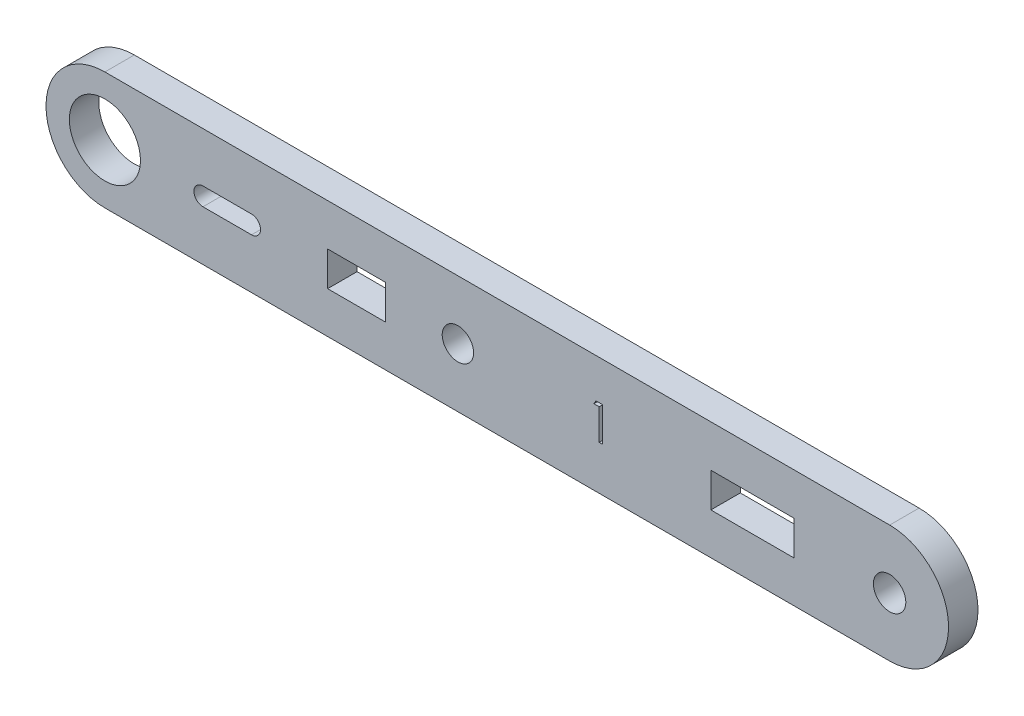
ISO-10303-21;
HEADER;
FILE_DESCRIPTION(('STEP AP214'),'2;1');
FILE_NAME('part.step','',(''),(''),'','','');
FILE_SCHEMA(('AUTOMOTIVE_DESIGN { 1 0 10303 214 1 1 1 1 }'));
ENDSEC;
DATA;
#1=APPLICATION_CONTEXT('core data for automotive mechanical design processes');
#2=APPLICATION_PROTOCOL_DEFINITION('international standard','automotive_design',2000,#1);
#3=PRODUCT_CONTEXT('',#1,'mechanical');
#4=PRODUCT('Part','Part','',(#3));
#5=PRODUCT_RELATED_PRODUCT_CATEGORY('part','',(#4));
#6=PRODUCT_DEFINITION_FORMATION('','',#4);
#7=PRODUCT_DEFINITION_CONTEXT('part definition',#1,'design');
#8=PRODUCT_DEFINITION('design','',#6,#7);
#9=PRODUCT_DEFINITION_SHAPE('','',#8);
#10=(LENGTH_UNIT() NAMED_UNIT(*) SI_UNIT(.MILLI.,.METRE.));
#11=(NAMED_UNIT(*) PLANE_ANGLE_UNIT() SI_UNIT($,.RADIAN.));
#12=(NAMED_UNIT(*) SI_UNIT($,.STERADIAN.) SOLID_ANGLE_UNIT());
#13=UNCERTAINTY_MEASURE_WITH_UNIT(LENGTH_MEASURE(1.E-05),#10,'distance_accuracy_value','');
#14=(GEOMETRIC_REPRESENTATION_CONTEXT(3) GLOBAL_UNCERTAINTY_ASSIGNED_CONTEXT((#13)) GLOBAL_UNIT_ASSIGNED_CONTEXT((#10,
#11,#12)) REPRESENTATION_CONTEXT('',''));
#15=CARTESIAN_POINT('',(0.,0.,0.));
#16=DIRECTION('',(0.,0.,1.));
#17=DIRECTION('',(1.,0.,0.));
#18=AXIS2_PLACEMENT_3D('',#15,#16,#17);
#19=CARTESIAN_POINT('',(30.6181719329405,6.,3.));
#20=DIRECTION('',(0.,0.,1.));
#21=DIRECTION('',(1.,0.,0.));
#22=AXIS2_PLACEMENT_3D('',#19,#20,#21);
#23=PLANE('',#22);
#24=CARTESIAN_POINT('',(-13.3753433024024,6.0002,3.));
#25=DIRECTION('',(0.,0.,1.));
#26=DIRECTION('',(1.,0.,0.));
#27=AXIS2_PLACEMENT_3D('',#24,#25,#26);
#28=CIRCLE('',#27,1.6);
#29=CARTESIAN_POINT('',(-11.7753433024024,6.0002,3.));
#30=VERTEX_POINT('',#29);
#31=EDGE_CURVE('E210',#30,#30,#28,.T.);
#32=ORIENTED_EDGE('',*,*,#31,.F.);
#33=EDGE_LOOP('',(#32));
#34=FACE_BOUND('',#33,.T.);
#35=CARTESIAN_POINT('',(-34.4047390861018,6.01717646772261,3.));
#36=DIRECTION('',(0.,0.,1.));
#37=DIRECTION('',(-1.,0.,0.));
#38=AXIS2_PLACEMENT_3D('',#35,#36,#37);
#39=CIRCLE('',#38,0.917076467722615);
#40=CARTESIAN_POINT('',(-34.4047390861018,5.1001,3.));
#41=VERTEX_POINT('',#40);
#42=CARTESIAN_POINT('',(-34.4047390861018,6.93425293544523,3.));
#43=VERTEX_POINT('',#42);
#44=EDGE_CURVE('E221',#41,#43,#39,.T.);
#45=ORIENTED_EDGE('',*,*,#44,.F.);
#46=DIRECTION('',(1.,0.,0.));
#47=VECTOR('',#46,1.);
#48=CARTESIAN_POINT('',(-34.4047390861018,5.1001,3.));
#49=LINE('',#48,#47);
#50=CARTESIAN_POINT('',(-39.3523475187029,5.10009999999999,3.));
#51=VERTEX_POINT('',#50);
#52=EDGE_CURVE('E227',#51,#41,#49,.T.);
#53=ORIENTED_EDGE('',*,*,#52,.F.);
#54=CARTESIAN_POINT('',(-39.3523475187029,6.01717646772261,3.));
#55=DIRECTION('',(0.,0.,1.));
#56=DIRECTION('',(-1.,0.,0.));
#57=AXIS2_PLACEMENT_3D('',#54,#55,#56);
#58=CIRCLE('',#57,0.917076467722618);
#59=CARTESIAN_POINT('',(-39.3523475187029,6.93425293544523,3.));
#60=VERTEX_POINT('',#59);
#61=EDGE_CURVE('E239',#60,#51,#58,.T.);
#62=ORIENTED_EDGE('',*,*,#61,.F.);
#63=DIRECTION('',(-1.,0.,0.));
#64=VECTOR('',#63,1.);
#65=CARTESIAN_POINT('',(-39.3523475187029,6.93425293544523,3.));
#66=LINE('',#65,#64);
#67=EDGE_CURVE('E236',#43,#60,#66,.T.);
#68=ORIENTED_EDGE('',*,*,#67,.F.);
#69=EDGE_LOOP('',(#45,#53,#62,#68));
#70=FACE_BOUND('',#69,.T.);
#71=CARTESIAN_POINT('',(-49.3435107871291,6.,3.));
#72=DIRECTION('',(0.,0.,1.));
#73=DIRECTION('',(-1.,0.,0.));
#74=AXIS2_PLACEMENT_3D('',#71,#72,#73);
#75=CIRCLE('',#74,3.62);
#76=CARTESIAN_POINT('',(-52.9635107871291,6.,3.));
#77=VERTEX_POINT('',#76);
#78=EDGE_CURVE('E246',#77,#77,#75,.T.);
#79=ORIENTED_EDGE('',*,*,#78,.F.);
#80=EDGE_LOOP('',(#79));
#81=FACE_BOUND('',#80,.T.);
#82=CARTESIAN_POINT('',(30.6116066975977,6.0001,3.));
#83=DIRECTION('',(0.,0.,1.));
#84=DIRECTION('',(-1.,0.,0.));
#85=AXIS2_PLACEMENT_3D('',#82,#83,#84);
#86=CIRCLE('',#85,1.65);
#87=CARTESIAN_POINT('',(28.9616066975977,6.0001,3.));
#88=VERTEX_POINT('',#87);
#89=EDGE_CURVE('E256',#88,#88,#86,.T.);
#90=ORIENTED_EDGE('',*,*,#89,.F.);
#91=EDGE_LOOP('',(#90));
#92=FACE_BOUND('',#91,.T.);
#93=DIRECTION('',(0.,-1.,0.));
#94=VECTOR('',#93,1.);
#95=CARTESIAN_POINT('',(12.399210674192,4.22396303268222,3.));
#96=LINE('',#95,#94);
#97=CARTESIAN_POINT('',(12.399210674192,7.73021248819516,3.));
#98=VERTEX_POINT('',#97);
#99=CARTESIAN_POINT('',(12.399210674192,4.22396303268222,3.));
#100=VERTEX_POINT('',#99);
#101=EDGE_CURVE('E262',#98,#100,#96,.T.);
#102=ORIENTED_EDGE('',*,*,#101,.F.);
#103=DIRECTION('',(-1.,0.,0.));
#104=VECTOR('',#103,1.);
#105=CARTESIAN_POINT('',(12.399210674192,7.73021248819516,3.));
#106=LINE('',#105,#104);
#107=CARTESIAN_POINT('',(20.8680208087544,7.73021248819516,3.));
#108=VERTEX_POINT('',#107);
#109=EDGE_CURVE('E269',#108,#98,#106,.T.);
#110=ORIENTED_EDGE('',*,*,#109,.F.);
#111=DIRECTION('',(0.,1.,0.));
#112=VECTOR('',#111,1.);
#113=CARTESIAN_POINT('',(20.8680208087544,7.73021248819516,3.));
#114=LINE('',#113,#112);
#115=CARTESIAN_POINT('',(20.8680208087544,4.22396303268222,3.));
#116=VERTEX_POINT('',#115);
#117=EDGE_CURVE('E283',#116,#108,#114,.T.);
#118=ORIENTED_EDGE('',*,*,#117,.F.);
#119=DIRECTION('',(1.,0.,0.));
#120=VECTOR('',#119,1.);
#121=CARTESIAN_POINT('',(20.8680208087544,4.22396303268222,3.));
#122=LINE('',#121,#120);
#123=EDGE_CURVE('E280',#100,#116,#122,.T.);
#124=ORIENTED_EDGE('',*,*,#123,.F.);
#125=EDGE_LOOP('',(#102,#110,#118,#124));
#126=FACE_BOUND('',#125,.T.);
#127=DIRECTION('',(0.,-1.,0.));
#128=VECTOR('',#127,1.);
#129=CARTESIAN_POINT('',(-26.6486464906883,4.22396303268221,3.));
#130=LINE('',#129,#128);
#131=CARTESIAN_POINT('',(-26.6486464906883,7.73021248819516,3.));
#132=VERTEX_POINT('',#131);
#133=CARTESIAN_POINT('',(-26.6486464906883,4.22396303268221,3.));
#134=VERTEX_POINT('',#133);
#135=EDGE_CURVE('E290',#132,#134,#130,.T.);
#136=ORIENTED_EDGE('',*,*,#135,.F.);
#137=DIRECTION('',(-1.,0.,0.));
#138=VECTOR('',#137,1.);
#139=CARTESIAN_POINT('',(-26.6486464906883,7.73021248819516,3.));
#140=LINE('',#139,#138);
#141=CARTESIAN_POINT('',(-20.7381895962742,7.73021248819516,3.));
#142=VERTEX_POINT('',#141);
#143=EDGE_CURVE('E301',#142,#132,#140,.T.);
#144=ORIENTED_EDGE('',*,*,#143,.F.);
#145=DIRECTION('',(0.,1.,0.));
#146=VECTOR('',#145,1.);
#147=CARTESIAN_POINT('',(-20.7381895962742,7.73021248819516,3.));
#148=LINE('',#147,#146);
#149=CARTESIAN_POINT('',(-20.7381895962742,4.22396303268221,3.));
#150=VERTEX_POINT('',#149);
#151=EDGE_CURVE('E315',#150,#142,#148,.T.);
#152=ORIENTED_EDGE('',*,*,#151,.F.);
#153=DIRECTION('',(1.,0.,0.));
#154=VECTOR('',#153,1.);
#155=CARTESIAN_POINT('',(-20.7381895962742,4.22396303268221,3.));
#156=LINE('',#155,#154);
#157=EDGE_CURVE('E312',#134,#150,#156,.T.);
#158=ORIENTED_EDGE('',*,*,#157,.F.);
#159=EDGE_LOOP('',(#136,#144,#152,#158));
#160=FACE_BOUND('',#159,.T.);
#161=CARTESIAN_POINT('',(30.6181719329405,6.,3.));
#162=DIRECTION('',(0.,0.,1.));
#163=DIRECTION('',(1.,0.,0.));
#164=AXIS2_PLACEMENT_3D('',#161,#162,#163);
#165=CIRCLE('',#164,6.);
#166=CARTESIAN_POINT('',(30.6181719329405,0.,3.));
#167=VERTEX_POINT('',#166);
#168=CARTESIAN_POINT('',(30.6181719329405,12.,3.));
#169=VERTEX_POINT('',#168);
#170=EDGE_CURVE('E322',#167,#169,#165,.T.);
#171=ORIENTED_EDGE('',*,*,#170,.T.);
#172=DIRECTION('',(-1.,0.,0.));
#173=VECTOR('',#172,1.);
#174=CARTESIAN_POINT('',(30.6181719329405,12.,3.));
#175=LINE('',#174,#173);
#176=CARTESIAN_POINT('',(-49.3435107871291,12.,3.));
#177=VERTEX_POINT('',#176);
#178=EDGE_CURVE('E344',#169,#177,#175,.T.);
#179=ORIENTED_EDGE('',*,*,#178,.T.);
#180=CARTESIAN_POINT('',(-49.3435107871291,6.,3.));
#181=DIRECTION('',(0.,0.,1.));
#182=DIRECTION('',(1.,0.,0.));
#183=AXIS2_PLACEMENT_3D('',#180,#181,#182);
#184=CIRCLE('',#183,6.);
#185=CARTESIAN_POINT('',(-49.3435107871291,0.,3.));
#186=VERTEX_POINT('',#185);
#187=EDGE_CURVE('E347',#177,#186,#184,.T.);
#188=ORIENTED_EDGE('',*,*,#187,.T.);
#189=DIRECTION('',(1.,0.,0.));
#190=VECTOR('',#189,1.);
#191=CARTESIAN_POINT('',(-49.3435107871291,0.,3.));
#192=LINE('',#191,#190);
#193=EDGE_CURVE('E333',#186,#167,#192,.T.);
#194=ORIENTED_EDGE('',*,*,#193,.T.);
#195=EDGE_LOOP('',(#171,#179,#188,#194));
#196=FACE_BOUND('',#195,.T.);
#197=DIRECTION('',(-1.,0.,0.));
#198=VECTOR('',#197,1.);
#199=CARTESIAN_POINT('',(1.02099440537843,7.63791250923838,3.));
#200=LINE('',#199,#198);
#201=CARTESIAN_POINT('',(1.02099440537843,7.63791250923838,3.));
#202=VERTEX_POINT('',#201);
#203=CARTESIAN_POINT('',(0.482532866916897,7.63791250923838,3.));
#204=VERTEX_POINT('',#203);
#205=EDGE_CURVE('E205',#202,#204,#200,.T.);
#206=ORIENTED_EDGE('',*,*,#205,.T.);
#207=DIRECTION('',(0.496686511837685,0.867930013859708,0.));
#208=VECTOR('',#207,1.);
#209=CARTESIAN_POINT('',(0.482532866916894,7.63791250923838,3.));
#210=LINE('',#209,#208);
#211=CARTESIAN_POINT('',(0.68796155281433,7.99688686821274,3.));
#212=VERTEX_POINT('',#211);
#213=EDGE_CURVE('E56',#204,#212,#210,.T.);
#214=ORIENTED_EDGE('',*,*,#213,.T.);
#215=DIRECTION('',(1.,0.,0.));
#216=VECTOR('',#215,1.);
#217=CARTESIAN_POINT('',(0.68796155281433,7.99688686821274,3.));
#218=LINE('',#217,#216);
#219=CARTESIAN_POINT('',(1.335096969481,7.99688686821274,3.));
#220=VERTEX_POINT('',#219);
#221=EDGE_CURVE('E209',#212,#220,#218,.T.);
#222=ORIENTED_EDGE('',*,*,#221,.T.);
#223=DIRECTION('',(0.,-1.,0.));
#224=VECTOR('',#223,1.);
#225=CARTESIAN_POINT('',(1.335096969481,7.99688686821274,3.));
#226=LINE('',#225,#224);
#227=CARTESIAN_POINT('',(1.335096969481,4.49688686821274,3.));
#228=VERTEX_POINT('',#227);
#229=EDGE_CURVE('E649',#220,#228,#226,.T.);
#230=ORIENTED_EDGE('',*,*,#229,.T.);
#231=DIRECTION('',(-1.,0.,0.));
#232=VECTOR('',#231,1.);
#233=CARTESIAN_POINT('',(1.335096969481,4.49688686821274,3.));
#234=LINE('',#233,#232);
#235=CARTESIAN_POINT('',(1.02099440537843,4.49688686821274,3.));
#236=VERTEX_POINT('',#235);
#237=EDGE_CURVE('E646',#228,#236,#234,.T.);
#238=ORIENTED_EDGE('',*,*,#237,.T.);
#239=DIRECTION('',(0.,1.,0.));
#240=VECTOR('',#239,1.);
#241=CARTESIAN_POINT('',(1.02099440537843,4.49688686821274,3.));
#242=LINE('',#241,#240);
#243=EDGE_CURVE('E640',#236,#202,#242,.T.);
#244=ORIENTED_EDGE('',*,*,#243,.T.);
#245=EDGE_LOOP('',(#206,#214,#222,#230,#238,#244));
#246=FACE_BOUND('',#245,.T.);
#247=ADVANCED_FACE('F39',(#34,#70,#81,#92,#126,#160,#196,#246),#23,.T.);
#248=CARTESIAN_POINT('',(30.6181719329405,6.,0.));
#249=DIRECTION('',(0.,0.,1.));
#250=DIRECTION('',(1.,0.,0.));
#251=AXIS2_PLACEMENT_3D('',#248,#249,#250);
#252=CYLINDRICAL_SURFACE('',#251,6.);
#253=ORIENTED_EDGE('',*,*,#170,.F.);
#254=DIRECTION('',(0.,0.,1.));
#255=VECTOR('',#254,1.);
#256=CARTESIAN_POINT('',(30.6181719329405,0.,0.));
#257=LINE('',#256,#255);
#258=CARTESIAN_POINT('',(30.6181719329405,0.,0.));
#259=VERTEX_POINT('',#258);
#260=EDGE_CURVE('E11',#259,#167,#257,.T.);
#261=ORIENTED_EDGE('',*,*,#260,.F.);
#262=CARTESIAN_POINT('',(30.6181719329405,6.,0.));
#263=DIRECTION('',(0.,0.,1.));
#264=DIRECTION('',(1.,0.,0.));
#265=AXIS2_PLACEMENT_3D('',#262,#263,#264);
#266=CIRCLE('',#265,6.);
#267=CARTESIAN_POINT('',(30.6181719329405,12.,0.));
#268=VERTEX_POINT('',#267);
#269=EDGE_CURVE('E329',#259,#268,#266,.T.);
#270=ORIENTED_EDGE('',*,*,#269,.T.);
#271=DIRECTION('',(0.,0.,1.));
#272=VECTOR('',#271,1.);
#273=CARTESIAN_POINT('',(30.6181719329405,12.,0.));
#274=LINE('',#273,#272);
#275=EDGE_CURVE('E43',#268,#169,#274,.T.);
#276=ORIENTED_EDGE('',*,*,#275,.T.);
#277=EDGE_LOOP('',(#253,#261,#270,#276));
#278=FACE_BOUND('',#277,.T.);
#279=ADVANCED_FACE('F41',(#278),#252,.T.);
#280=CARTESIAN_POINT('',(-49.3435107871291,0.,0.));
#281=DIRECTION('',(0.,-1.,0.));
#282=DIRECTION('',(0.,0.,-1.));
#283=AXIS2_PLACEMENT_3D('',#280,#281,#282);
#284=PLANE('',#283);
#285=ORIENTED_EDGE('',*,*,#193,.F.);
#286=DIRECTION('',(0.,0.,1.));
#287=VECTOR('',#286,1.);
#288=CARTESIAN_POINT('',(-49.3435107871291,0.,0.));
#289=LINE('',#288,#287);
#290=CARTESIAN_POINT('',(-49.3435107871291,0.,0.));
#291=VERTEX_POINT('',#290);
#292=EDGE_CURVE('E48',#291,#186,#289,.T.);
#293=ORIENTED_EDGE('',*,*,#292,.F.);
#294=DIRECTION('',(1.,0.,0.));
#295=VECTOR('',#294,1.);
#296=CARTESIAN_POINT('',(-49.3435107871291,0.,0.));
#297=LINE('',#296,#295);
#298=EDGE_CURVE('E339',#291,#259,#297,.T.);
#299=ORIENTED_EDGE('',*,*,#298,.T.);
#300=ORIENTED_EDGE('',*,*,#260,.T.);
#301=EDGE_LOOP('',(#285,#293,#299,#300));
#302=FACE_BOUND('',#301,.T.);
#303=ADVANCED_FACE('F365',(#302),#284,.T.);
#304=CARTESIAN_POINT('',(-49.3435107871291,6.,0.));
#305=DIRECTION('',(0.,0.,1.));
#306=DIRECTION('',(1.,0.,0.));
#307=AXIS2_PLACEMENT_3D('',#304,#305,#306);
#308=CYLINDRICAL_SURFACE('',#307,6.);
#309=ORIENTED_EDGE('',*,*,#187,.F.);
#310=DIRECTION('',(0.,0.,1.));
#311=VECTOR('',#310,1.);
#312=CARTESIAN_POINT('',(-49.3435107871291,12.,0.));
#313=LINE('',#312,#311);
#314=CARTESIAN_POINT('',(-49.3435107871291,12.,0.));
#315=VERTEX_POINT('',#314);
#316=EDGE_CURVE('E352',#315,#177,#313,.T.);
#317=ORIENTED_EDGE('',*,*,#316,.F.);
#318=CARTESIAN_POINT('',(-49.3435107871291,6.,0.));
#319=DIRECTION('',(0.,0.,1.));
#320=DIRECTION('',(1.,0.,0.));
#321=AXIS2_PLACEMENT_3D('',#318,#319,#320);
#322=CIRCLE('',#321,6.);
#323=EDGE_CURVE('E336',#315,#291,#322,.T.);
#324=ORIENTED_EDGE('',*,*,#323,.T.);
#325=ORIENTED_EDGE('',*,*,#292,.T.);
#326=EDGE_LOOP('',(#309,#317,#324,#325));
#327=FACE_BOUND('',#326,.T.);
#328=ADVANCED_FACE('F371',(#327),#308,.T.);
#329=CARTESIAN_POINT('',(30.6181719329405,12.,0.));
#330=DIRECTION('',(0.,1.,0.));
#331=DIRECTION('',(0.,0.,1.));
#332=AXIS2_PLACEMENT_3D('',#329,#330,#331);
#333=PLANE('',#332);
#334=ORIENTED_EDGE('',*,*,#178,.F.);
#335=ORIENTED_EDGE('',*,*,#275,.F.);
#336=DIRECTION('',(-1.,0.,0.));
#337=VECTOR('',#336,1.);
#338=CARTESIAN_POINT('',(30.6181719329405,12.,0.));
#339=LINE('',#338,#337);
#340=EDGE_CURVE('E332',#268,#315,#339,.T.);
#341=ORIENTED_EDGE('',*,*,#340,.T.);
#342=ORIENTED_EDGE('',*,*,#316,.T.);
#343=EDGE_LOOP('',(#334,#335,#341,#342));
#344=FACE_BOUND('',#343,.T.);
#345=ADVANCED_FACE('F360',(#344),#333,.T.);
#346=CARTESIAN_POINT('',(30.6181719329405,6.,0.));
#347=DIRECTION('',(0.,0.,1.));
#348=DIRECTION('',(1.,0.,0.));
#349=AXIS2_PLACEMENT_3D('',#346,#347,#348);
#350=PLANE('',#349);
#351=CARTESIAN_POINT('',(-13.3753433024024,6.0002,0.));
#352=DIRECTION('',(0.,0.,1.));
#353=DIRECTION('',(1.,0.,0.));
#354=AXIS2_PLACEMENT_3D('',#351,#352,#353);
#355=CIRCLE('',#354,1.6);
#356=CARTESIAN_POINT('',(-11.7753433024024,6.0002,0.));
#357=VERTEX_POINT('',#356);
#358=EDGE_CURVE('E214',#357,#357,#355,.T.);
#359=ORIENTED_EDGE('',*,*,#358,.T.);
#360=EDGE_LOOP('',(#359));
#361=FACE_BOUND('',#360,.T.);
#362=DIRECTION('',(1.,0.,0.));
#363=VECTOR('',#362,1.);
#364=CARTESIAN_POINT('',(-34.4047390861018,5.1001,0.));
#365=LINE('',#364,#363);
#366=CARTESIAN_POINT('',(-39.3523475187029,5.10009999999999,0.));
#367=VERTEX_POINT('',#366);
#368=CARTESIAN_POINT('',(-34.4047390861018,5.1001,0.));
#369=VERTEX_POINT('',#368);
#370=EDGE_CURVE('E231',#367,#369,#365,.T.);
#371=ORIENTED_EDGE('',*,*,#370,.T.);
#372=CARTESIAN_POINT('',(-34.4047390861018,6.01717646772261,0.));
#373=DIRECTION('',(0.,0.,1.));
#374=DIRECTION('',(-1.,0.,0.));
#375=AXIS2_PLACEMENT_3D('',#372,#373,#374);
#376=CIRCLE('',#375,0.917076467722615);
#377=CARTESIAN_POINT('',(-34.4047390861018,6.93425293544523,0.));
#378=VERTEX_POINT('',#377);
#379=EDGE_CURVE('E223',#369,#378,#376,.T.);
#380=ORIENTED_EDGE('',*,*,#379,.T.);
#381=DIRECTION('',(-1.,0.,0.));
#382=VECTOR('',#381,1.);
#383=CARTESIAN_POINT('',(-39.3523475187029,6.93425293544523,0.));
#384=LINE('',#383,#382);
#385=CARTESIAN_POINT('',(-39.3523475187029,6.93425293544523,0.));
#386=VERTEX_POINT('',#385);
#387=EDGE_CURVE('E226',#378,#386,#384,.T.);
#388=ORIENTED_EDGE('',*,*,#387,.T.);
#389=CARTESIAN_POINT('',(-39.3523475187029,6.01717646772261,0.));
#390=DIRECTION('',(0.,0.,1.));
#391=DIRECTION('',(-1.,0.,0.));
#392=AXIS2_PLACEMENT_3D('',#389,#390,#391);
#393=CIRCLE('',#392,0.917076467722618);
#394=EDGE_CURVE('E64',#386,#367,#393,.T.);
#395=ORIENTED_EDGE('',*,*,#394,.T.);
#396=EDGE_LOOP('',(#371,#380,#388,#395));
#397=FACE_BOUND('',#396,.T.);
#398=CARTESIAN_POINT('',(-49.3435107871291,6.,0.));
#399=DIRECTION('',(0.,0.,1.));
#400=DIRECTION('',(-1.,0.,0.));
#401=AXIS2_PLACEMENT_3D('',#398,#399,#400);
#402=CIRCLE('',#401,3.62);
#403=CARTESIAN_POINT('',(-52.9635107871291,6.,0.));
#404=VERTEX_POINT('',#403);
#405=EDGE_CURVE('E253',#404,#404,#402,.T.);
#406=ORIENTED_EDGE('',*,*,#405,.T.);
#407=EDGE_LOOP('',(#406));
#408=FACE_BOUND('',#407,.T.);
#409=CARTESIAN_POINT('',(30.6116066975977,6.0001,0.));
#410=DIRECTION('',(0.,0.,1.));
#411=DIRECTION('',(-1.,0.,0.));
#412=AXIS2_PLACEMENT_3D('',#409,#410,#411);
#413=CIRCLE('',#412,1.65);
#414=CARTESIAN_POINT('',(28.9616066975977,6.0001,0.));
#415=VERTEX_POINT('',#414);
#416=EDGE_CURVE('E259',#415,#415,#413,.T.);
#417=ORIENTED_EDGE('',*,*,#416,.T.);
#418=EDGE_LOOP('',(#417));
#419=FACE_BOUND('',#418,.T.);
#420=DIRECTION('',(-1.,0.,0.));
#421=VECTOR('',#420,1.);
#422=CARTESIAN_POINT('',(12.399210674192,7.73021248819516,0.));
#423=LINE('',#422,#421);
#424=CARTESIAN_POINT('',(20.8680208087544,7.73021248819516,0.));
#425=VERTEX_POINT('',#424);
#426=CARTESIAN_POINT('',(12.399210674192,7.73021248819516,0.));
#427=VERTEX_POINT('',#426);
#428=EDGE_CURVE('E275',#425,#427,#423,.T.);
#429=ORIENTED_EDGE('',*,*,#428,.T.);
#430=DIRECTION('',(0.,-1.,0.));
#431=VECTOR('',#430,1.);
#432=CARTESIAN_POINT('',(12.399210674192,4.22396303268222,0.));
#433=LINE('',#432,#431);
#434=CARTESIAN_POINT('',(12.399210674192,4.22396303268222,0.));
#435=VERTEX_POINT('',#434);
#436=EDGE_CURVE('E265',#427,#435,#433,.T.);
#437=ORIENTED_EDGE('',*,*,#436,.T.);
#438=DIRECTION('',(1.,0.,0.));
#439=VECTOR('',#438,1.);
#440=CARTESIAN_POINT('',(20.8680208087544,4.22396303268222,0.));
#441=LINE('',#440,#439);
#442=CARTESIAN_POINT('',(20.8680208087544,4.22396303268222,0.));
#443=VERTEX_POINT('',#442);
#444=EDGE_CURVE('E268',#435,#443,#441,.T.);
#445=ORIENTED_EDGE('',*,*,#444,.T.);
#446=DIRECTION('',(0.,1.,0.));
#447=VECTOR('',#446,1.);
#448=CARTESIAN_POINT('',(20.8680208087544,7.73021248819516,0.));
#449=LINE('',#448,#447);
#450=EDGE_CURVE('E272',#443,#425,#449,.T.);
#451=ORIENTED_EDGE('',*,*,#450,.T.);
#452=EDGE_LOOP('',(#429,#437,#445,#451));
#453=FACE_BOUND('',#452,.T.);
#454=DIRECTION('',(-1.,0.,0.));
#455=VECTOR('',#454,1.);
#456=CARTESIAN_POINT('',(-26.6486464906883,7.73021248819516,0.));
#457=LINE('',#456,#455);
#458=CARTESIAN_POINT('',(-20.7381895962742,7.73021248819516,0.));
#459=VERTEX_POINT('',#458);
#460=CARTESIAN_POINT('',(-26.6486464906883,7.73021248819516,0.));
#461=VERTEX_POINT('',#460);
#462=EDGE_CURVE('E307',#459,#461,#457,.T.);
#463=ORIENTED_EDGE('',*,*,#462,.T.);
#464=DIRECTION('',(0.,-1.,0.));
#465=VECTOR('',#464,1.);
#466=CARTESIAN_POINT('',(-26.6486464906883,4.22396303268221,0.));
#467=LINE('',#466,#465);
#468=CARTESIAN_POINT('',(-26.6486464906883,4.22396303268221,0.));
#469=VERTEX_POINT('',#468);
#470=EDGE_CURVE('E297',#461,#469,#467,.T.);
#471=ORIENTED_EDGE('',*,*,#470,.T.);
#472=DIRECTION('',(1.,0.,0.));
#473=VECTOR('',#472,1.);
#474=CARTESIAN_POINT('',(-20.7381895962742,4.22396303268221,0.));
#475=LINE('',#474,#473);
#476=CARTESIAN_POINT('',(-20.7381895962742,4.22396303268221,0.));
#477=VERTEX_POINT('',#476);
#478=EDGE_CURVE('E300',#469,#477,#475,.T.);
#479=ORIENTED_EDGE('',*,*,#478,.T.);
#480=DIRECTION('',(0.,1.,0.));
#481=VECTOR('',#480,1.);
#482=CARTESIAN_POINT('',(-20.7381895962742,7.73021248819516,0.));
#483=LINE('',#482,#481);
#484=EDGE_CURVE('E304',#477,#459,#483,.T.);
#485=ORIENTED_EDGE('',*,*,#484,.T.);
#486=EDGE_LOOP('',(#463,#471,#479,#485));
#487=FACE_BOUND('',#486,.T.);
#488=ORIENTED_EDGE('',*,*,#269,.F.);
#489=ORIENTED_EDGE('',*,*,#298,.F.);
#490=ORIENTED_EDGE('',*,*,#323,.F.);
#491=ORIENTED_EDGE('',*,*,#340,.F.);
#492=EDGE_LOOP('',(#488,#489,#490,#491));
#493=FACE_BOUND('',#492,.T.);
#494=ADVANCED_FACE('F368',(#361,#397,#408,#419,#453,#487,#493),#350,.F.);
#495=CARTESIAN_POINT('',(-26.6486464906883,4.22396303268221,0.));
#496=DIRECTION('',(-1.,0.,0.));
#497=DIRECTION('',(0.,0.,1.));
#498=AXIS2_PLACEMENT_3D('',#495,#496,#497);
#499=PLANE('',#498);
#500=ORIENTED_EDGE('',*,*,#135,.T.);
#501=DIRECTION('',(0.,0.,1.));
#502=VECTOR('',#501,1.);
#503=CARTESIAN_POINT('',(-26.6486464906883,4.22396303268221,0.));
#504=LINE('',#503,#502);
#505=EDGE_CURVE('E310',#469,#134,#504,.T.);
#506=ORIENTED_EDGE('',*,*,#505,.F.);
#507=ORIENTED_EDGE('',*,*,#470,.F.);
#508=DIRECTION('',(0.,0.,1.));
#509=VECTOR('',#508,1.);
#510=CARTESIAN_POINT('',(-26.6486464906883,7.73021248819516,0.));
#511=LINE('',#510,#509);
#512=EDGE_CURVE('E320',#461,#132,#511,.T.);
#513=ORIENTED_EDGE('',*,*,#512,.T.);
#514=EDGE_LOOP('',(#500,#506,#507,#513));
#515=FACE_BOUND('',#514,.T.);
#516=ADVANCED_FACE('F392',(#515),#499,.F.);
#517=CARTESIAN_POINT('',(-26.6486464906883,7.73021248819516,0.));
#518=DIRECTION('',(0.,1.,0.));
#519=DIRECTION('',(0.,0.,1.));
#520=AXIS2_PLACEMENT_3D('',#517,#518,#519);
#521=PLANE('',#520);
#522=ORIENTED_EDGE('',*,*,#143,.T.);
#523=ORIENTED_EDGE('',*,*,#512,.F.);
#524=ORIENTED_EDGE('',*,*,#462,.F.);
#525=DIRECTION('',(0.,0.,1.));
#526=VECTOR('',#525,1.);
#527=CARTESIAN_POINT('',(-20.7381895962742,7.73021248819516,0.));
#528=LINE('',#527,#526);
#529=EDGE_CURVE('E323',#459,#142,#528,.T.);
#530=ORIENTED_EDGE('',*,*,#529,.T.);
#531=EDGE_LOOP('',(#522,#523,#524,#530));
#532=FACE_BOUND('',#531,.T.);
#533=ADVANCED_FACE('F396',(#532),#521,.F.);
#534=CARTESIAN_POINT('',(-20.7381895962742,7.73021248819516,0.));
#535=DIRECTION('',(1.,0.,0.));
#536=DIRECTION('',(0.,0.,-1.));
#537=AXIS2_PLACEMENT_3D('',#534,#535,#536);
#538=PLANE('',#537);
#539=ORIENTED_EDGE('',*,*,#151,.T.);
#540=ORIENTED_EDGE('',*,*,#529,.F.);
#541=ORIENTED_EDGE('',*,*,#484,.F.);
#542=DIRECTION('',(0.,0.,1.));
#543=VECTOR('',#542,1.);
#544=CARTESIAN_POINT('',(-20.7381895962742,4.22396303268221,0.));
#545=LINE('',#544,#543);
#546=EDGE_CURVE('E325',#477,#150,#545,.T.);
#547=ORIENTED_EDGE('',*,*,#546,.T.);
#548=EDGE_LOOP('',(#539,#540,#541,#547));
#549=FACE_BOUND('',#548,.T.);
#550=ADVANCED_FACE('F402',(#549),#538,.F.);
#551=CARTESIAN_POINT('',(-20.7381895962742,4.22396303268221,0.));
#552=DIRECTION('',(0.,-1.,0.));
#553=DIRECTION('',(0.,0.,-1.));
#554=AXIS2_PLACEMENT_3D('',#551,#552,#553);
#555=PLANE('',#554);
#556=ORIENTED_EDGE('',*,*,#157,.T.);
#557=ORIENTED_EDGE('',*,*,#546,.F.);
#558=ORIENTED_EDGE('',*,*,#478,.F.);
#559=ORIENTED_EDGE('',*,*,#505,.T.);
#560=EDGE_LOOP('',(#556,#557,#558,#559));
#561=FACE_BOUND('',#560,.T.);
#562=ADVANCED_FACE('F398',(#561),#555,.F.);
#563=CARTESIAN_POINT('',(12.399210674192,4.22396303268222,0.));
#564=DIRECTION('',(-1.,0.,0.));
#565=DIRECTION('',(0.,0.,1.));
#566=AXIS2_PLACEMENT_3D('',#563,#564,#565);
#567=PLANE('',#566);
#568=ORIENTED_EDGE('',*,*,#101,.T.);
#569=DIRECTION('',(0.,0.,1.));
#570=VECTOR('',#569,1.);
#571=CARTESIAN_POINT('',(12.399210674192,4.22396303268222,0.));
#572=LINE('',#571,#570);
#573=EDGE_CURVE('E278',#435,#100,#572,.T.);
#574=ORIENTED_EDGE('',*,*,#573,.F.);
#575=ORIENTED_EDGE('',*,*,#436,.F.);
#576=DIRECTION('',(0.,0.,1.));
#577=VECTOR('',#576,1.);
#578=CARTESIAN_POINT('',(12.399210674192,7.73021248819516,0.));
#579=LINE('',#578,#577);
#580=EDGE_CURVE('E288',#427,#98,#579,.T.);
#581=ORIENTED_EDGE('',*,*,#580,.T.);
#582=EDGE_LOOP('',(#568,#574,#575,#581));
#583=FACE_BOUND('',#582,.T.);
#584=ADVANCED_FACE('F401',(#583),#567,.F.);
#585=CARTESIAN_POINT('',(12.399210674192,7.73021248819516,0.));
#586=DIRECTION('',(0.,1.,0.));
#587=DIRECTION('',(0.,0.,1.));
#588=AXIS2_PLACEMENT_3D('',#585,#586,#587);
#589=PLANE('',#588);
#590=ORIENTED_EDGE('',*,*,#109,.T.);
#591=ORIENTED_EDGE('',*,*,#580,.F.);
#592=ORIENTED_EDGE('',*,*,#428,.F.);
#593=DIRECTION('',(0.,0.,1.));
#594=VECTOR('',#593,1.);
#595=CARTESIAN_POINT('',(20.8680208087544,7.73021248819516,0.));
#596=LINE('',#595,#594);
#597=EDGE_CURVE('E291',#425,#108,#596,.T.);
#598=ORIENTED_EDGE('',*,*,#597,.T.);
#599=EDGE_LOOP('',(#590,#591,#592,#598));
#600=FACE_BOUND('',#599,.T.);
#601=ADVANCED_FACE('F412',(#600),#589,.F.);
#602=CARTESIAN_POINT('',(20.8680208087544,7.73021248819516,0.));
#603=DIRECTION('',(1.,0.,0.));
#604=DIRECTION('',(0.,0.,-1.));
#605=AXIS2_PLACEMENT_3D('',#602,#603,#604);
#606=PLANE('',#605);
#607=ORIENTED_EDGE('',*,*,#117,.T.);
#608=ORIENTED_EDGE('',*,*,#597,.F.);
#609=ORIENTED_EDGE('',*,*,#450,.F.);
#610=DIRECTION('',(0.,0.,1.));
#611=VECTOR('',#610,1.);
#612=CARTESIAN_POINT('',(20.8680208087544,4.22396303268222,0.));
#613=LINE('',#612,#611);
#614=EDGE_CURVE('E293',#443,#116,#613,.T.);
#615=ORIENTED_EDGE('',*,*,#614,.T.);
#616=EDGE_LOOP('',(#607,#608,#609,#615));
#617=FACE_BOUND('',#616,.T.);
#618=ADVANCED_FACE('F418',(#617),#606,.F.);
#619=CARTESIAN_POINT('',(20.8680208087544,4.22396303268222,0.));
#620=DIRECTION('',(0.,-1.,0.));
#621=DIRECTION('',(0.,0.,-1.));
#622=AXIS2_PLACEMENT_3D('',#619,#620,#621);
#623=PLANE('',#622);
#624=ORIENTED_EDGE('',*,*,#123,.T.);
#625=ORIENTED_EDGE('',*,*,#614,.F.);
#626=ORIENTED_EDGE('',*,*,#444,.F.);
#627=ORIENTED_EDGE('',*,*,#573,.T.);
#628=EDGE_LOOP('',(#624,#625,#626,#627));
#629=FACE_BOUND('',#628,.T.);
#630=ADVANCED_FACE('F414',(#629),#623,.F.);
#631=CARTESIAN_POINT('',(30.6116066975977,6.0001,0.));
#632=DIRECTION('',(0.,0.,1.));
#633=DIRECTION('',(1.,0.,0.));
#634=AXIS2_PLACEMENT_3D('',#631,#632,#633);
#635=CYLINDRICAL_SURFACE('',#634,1.65);
#636=ORIENTED_EDGE('',*,*,#416,.F.);
#637=EDGE_LOOP('',(#636));
#638=FACE_BOUND('',#637,.T.);
#639=ORIENTED_EDGE('',*,*,#89,.T.);
#640=EDGE_LOOP('',(#639));
#641=FACE_BOUND('',#640,.T.);
#642=ADVANCED_FACE('F417',(#638,#641),#635,.F.);
#643=CARTESIAN_POINT('',(-49.3435107871291,6.,0.));
#644=DIRECTION('',(0.,0.,1.));
#645=DIRECTION('',(1.,0.,0.));
#646=AXIS2_PLACEMENT_3D('',#643,#644,#645);
#647=CYLINDRICAL_SURFACE('',#646,3.62);
#648=ORIENTED_EDGE('',*,*,#405,.F.);
#649=EDGE_LOOP('',(#648));
#650=FACE_BOUND('',#649,.T.);
#651=ORIENTED_EDGE('',*,*,#78,.T.);
#652=EDGE_LOOP('',(#651));
#653=FACE_BOUND('',#652,.T.);
#654=ADVANCED_FACE('F428',(#650,#653),#647,.F.);
#655=CARTESIAN_POINT('',(-34.4047390861018,6.01717646772261,0.));
#656=DIRECTION('',(0.,0.,1.));
#657=DIRECTION('',(1.,0.,0.));
#658=AXIS2_PLACEMENT_3D('',#655,#656,#657);
#659=CYLINDRICAL_SURFACE('',#658,0.917076467722615);
#660=ORIENTED_EDGE('',*,*,#44,.T.);
#661=DIRECTION('',(0.,0.,1.));
#662=VECTOR('',#661,1.);
#663=CARTESIAN_POINT('',(-34.4047390861018,6.93425293544523,0.));
#664=LINE('',#663,#662);
#665=EDGE_CURVE('E234',#378,#43,#664,.T.);
#666=ORIENTED_EDGE('',*,*,#665,.F.);
#667=ORIENTED_EDGE('',*,*,#379,.F.);
#668=DIRECTION('',(0.,0.,1.));
#669=VECTOR('',#668,1.);
#670=CARTESIAN_POINT('',(-34.4047390861018,5.1001,0.));
#671=LINE('',#670,#669);
#672=EDGE_CURVE('E244',#369,#41,#671,.T.);
#673=ORIENTED_EDGE('',*,*,#672,.T.);
#674=EDGE_LOOP('',(#660,#666,#667,#673));
#675=FACE_BOUND('',#674,.T.);
#676=ADVANCED_FACE('F432',(#675),#659,.F.);
#677=CARTESIAN_POINT('',(-34.4047390861018,5.1001,0.));
#678=DIRECTION('',(0.,-1.,0.));
#679=DIRECTION('',(1.,0.,0.));
#680=AXIS2_PLACEMENT_3D('',#677,#678,#679);
#681=PLANE('',#680);
#682=ORIENTED_EDGE('',*,*,#52,.T.);
#683=ORIENTED_EDGE('',*,*,#672,.F.);
#684=ORIENTED_EDGE('',*,*,#370,.F.);
#685=DIRECTION('',(0.,0.,1.));
#686=VECTOR('',#685,1.);
#687=CARTESIAN_POINT('',(-39.3523475187029,5.10009999999999,0.));
#688=LINE('',#687,#686);
#689=EDGE_CURVE('E247',#367,#51,#688,.T.);
#690=ORIENTED_EDGE('',*,*,#689,.T.);
#691=EDGE_LOOP('',(#682,#683,#684,#690));
#692=FACE_BOUND('',#691,.T.);
#693=ADVANCED_FACE('F436',(#692),#681,.F.);
#694=CARTESIAN_POINT('',(-39.3523475187029,6.01717646772261,0.));
#695=DIRECTION('',(0.,0.,1.));
#696=DIRECTION('',(1.,0.,0.));
#697=AXIS2_PLACEMENT_3D('',#694,#695,#696);
#698=CYLINDRICAL_SURFACE('',#697,0.917076467722618);
#699=ORIENTED_EDGE('',*,*,#61,.T.);
#700=ORIENTED_EDGE('',*,*,#689,.F.);
#701=ORIENTED_EDGE('',*,*,#394,.F.);
#702=DIRECTION('',(0.,0.,1.));
#703=VECTOR('',#702,1.);
#704=CARTESIAN_POINT('',(-39.3523475187029,6.93425293544523,0.));
#705=LINE('',#704,#703);
#706=EDGE_CURVE('E249',#386,#60,#705,.T.);
#707=ORIENTED_EDGE('',*,*,#706,.T.);
#708=EDGE_LOOP('',(#699,#700,#701,#707));
#709=FACE_BOUND('',#708,.T.);
#710=ADVANCED_FACE('F442',(#709),#698,.F.);
#711=CARTESIAN_POINT('',(-39.3523475187029,6.93425293544523,0.));
#712=DIRECTION('',(0.,1.,0.));
#713=DIRECTION('',(0.,0.,1.));
#714=AXIS2_PLACEMENT_3D('',#711,#712,#713);
#715=PLANE('',#714);
#716=ORIENTED_EDGE('',*,*,#67,.T.);
#717=ORIENTED_EDGE('',*,*,#706,.F.);
#718=ORIENTED_EDGE('',*,*,#387,.F.);
#719=ORIENTED_EDGE('',*,*,#665,.T.);
#720=EDGE_LOOP('',(#716,#717,#718,#719));
#721=FACE_BOUND('',#720,.T.);
#722=ADVANCED_FACE('F438',(#721),#715,.F.);
#723=CARTESIAN_POINT('',(-13.3753433024024,6.0002,0.));
#724=DIRECTION('',(0.,0.,1.));
#725=DIRECTION('',(1.,0.,0.));
#726=AXIS2_PLACEMENT_3D('',#723,#724,#725);
#727=CYLINDRICAL_SURFACE('',#726,1.6);
#728=ORIENTED_EDGE('',*,*,#358,.F.);
#729=EDGE_LOOP('',(#728));
#730=FACE_BOUND('',#729,.T.);
#731=ORIENTED_EDGE('',*,*,#31,.T.);
#732=EDGE_LOOP('',(#731));
#733=FACE_BOUND('',#732,.T.);
#734=ADVANCED_FACE('F441',(#730,#733),#727,.F.);
#735=CARTESIAN_POINT('',(0.482532866916894,7.63791250923838,2.));
#736=DIRECTION('',(0.867930013859708,-0.496686511837685,0.));
#737=DIRECTION('',(0.496686511837685,0.867930013859708,0.));
#738=AXIS2_PLACEMENT_3D('',#735,#736,#737);
#739=PLANE('',#738);
#740=ORIENTED_EDGE('',*,*,#213,.F.);
#741=DIRECTION('',(0.,0.,1.));
#742=VECTOR('',#741,1.);
#743=CARTESIAN_POINT('',(0.482532866916894,7.63791250923838,2.));
#744=LINE('',#743,#742);
#745=CARTESIAN_POINT('',(0.482532866916894,7.63791250923838,2.));
#746=VERTEX_POINT('',#745);
#747=EDGE_CURVE('E204',#746,#204,#744,.T.);
#748=ORIENTED_EDGE('',*,*,#747,.F.);
#749=DIRECTION('',(0.496686511837685,0.867930013859708,0.));
#750=VECTOR('',#749,1.);
#751=CARTESIAN_POINT('',(0.482532866916894,7.63791250923838,2.));
#752=LINE('',#751,#750);
#753=CARTESIAN_POINT('',(0.68796155281433,7.99688686821274,2.));
#754=VERTEX_POINT('',#753);
#755=EDGE_CURVE('E195',#746,#754,#752,.T.);
#756=ORIENTED_EDGE('',*,*,#755,.T.);
#757=DIRECTION('',(0.,0.,1.));
#758=VECTOR('',#757,1.);
#759=CARTESIAN_POINT('',(0.68796155281433,7.99688686821274,2.));
#760=LINE('',#759,#758);
#761=EDGE_CURVE('E203',#754,#212,#760,.T.);
#762=ORIENTED_EDGE('',*,*,#761,.T.);
#763=EDGE_LOOP('',(#740,#748,#756,#762));
#764=FACE_BOUND('',#763,.T.);
#765=ADVANCED_FACE('F202',(#764),#739,.T.);
#766=CARTESIAN_POINT('',(0.68796155281433,7.99688686821274,2.));
#767=DIRECTION('',(0.,-1.,0.));
#768=DIRECTION('',(0.,0.,-1.));
#769=AXIS2_PLACEMENT_3D('',#766,#767,#768);
#770=PLANE('',#769);
#771=ORIENTED_EDGE('',*,*,#221,.F.);
#772=ORIENTED_EDGE('',*,*,#761,.F.);
#773=DIRECTION('',(1.,0.,0.));
#774=VECTOR('',#773,1.);
#775=CARTESIAN_POINT('',(0.68796155281433,7.99688686821274,2.));
#776=LINE('',#775,#774);
#777=CARTESIAN_POINT('',(1.335096969481,7.99688686821274,2.));
#778=VERTEX_POINT('',#777);
#779=EDGE_CURVE('E191',#754,#778,#776,.T.);
#780=ORIENTED_EDGE('',*,*,#779,.T.);
#781=DIRECTION('',(0.,0.,1.));
#782=VECTOR('',#781,1.);
#783=CARTESIAN_POINT('',(1.335096969481,7.99688686821274,2.));
#784=LINE('',#783,#782);
#785=EDGE_CURVE('E211',#778,#220,#784,.T.);
#786=ORIENTED_EDGE('',*,*,#785,.T.);
#787=EDGE_LOOP('',(#771,#772,#780,#786));
#788=FACE_BOUND('',#787,.T.);
#789=ADVANCED_FACE('F207',(#788),#770,.T.);
#790=CARTESIAN_POINT('',(1.335096969481,7.99688686821274,2.));
#791=DIRECTION('',(-1.,0.,0.));
#792=DIRECTION('',(0.,0.,1.));
#793=AXIS2_PLACEMENT_3D('',#790,#791,#792);
#794=PLANE('',#793);
#795=ORIENTED_EDGE('',*,*,#229,.F.);
#796=ORIENTED_EDGE('',*,*,#785,.F.);
#797=DIRECTION('',(0.,-1.,0.));
#798=VECTOR('',#797,1.);
#799=CARTESIAN_POINT('',(1.335096969481,7.99688686821274,2.));
#800=LINE('',#799,#798);
#801=CARTESIAN_POINT('',(1.335096969481,4.49688686821274,2.));
#802=VERTEX_POINT('',#801);
#803=EDGE_CURVE('E197',#778,#802,#800,.T.);
#804=ORIENTED_EDGE('',*,*,#803,.T.);
#805=DIRECTION('',(0.,0.,1.));
#806=VECTOR('',#805,1.);
#807=CARTESIAN_POINT('',(1.335096969481,4.49688686821274,2.));
#808=LINE('',#807,#806);
#809=EDGE_CURVE('E216',#802,#228,#808,.T.);
#810=ORIENTED_EDGE('',*,*,#809,.T.);
#811=EDGE_LOOP('',(#795,#796,#804,#810));
#812=FACE_BOUND('',#811,.T.);
#813=ADVANCED_FACE('F454',(#812),#794,.T.);
#814=CARTESIAN_POINT('',(1.335096969481,4.49688686821274,2.));
#815=DIRECTION('',(0.,1.,0.));
#816=DIRECTION('',(0.,0.,1.));
#817=AXIS2_PLACEMENT_3D('',#814,#815,#816);
#818=PLANE('',#817);
#819=ORIENTED_EDGE('',*,*,#237,.F.);
#820=ORIENTED_EDGE('',*,*,#809,.F.);
#821=DIRECTION('',(-1.,0.,0.));
#822=VECTOR('',#821,1.);
#823=CARTESIAN_POINT('',(1.335096969481,4.49688686821274,2.));
#824=LINE('',#823,#822);
#825=CARTESIAN_POINT('',(1.02099440537843,4.49688686821274,2.));
#826=VERTEX_POINT('',#825);
#827=EDGE_CURVE('E665',#802,#826,#824,.T.);
#828=ORIENTED_EDGE('',*,*,#827,.T.);
#829=DIRECTION('',(0.,0.,1.));
#830=VECTOR('',#829,1.);
#831=CARTESIAN_POINT('',(1.02099440537843,4.49688686821274,2.));
#832=LINE('',#831,#830);
#833=EDGE_CURVE('E656',#826,#236,#832,.T.);
#834=ORIENTED_EDGE('',*,*,#833,.T.);
#835=EDGE_LOOP('',(#819,#820,#828,#834));
#836=FACE_BOUND('',#835,.T.);
#837=ADVANCED_FACE('F457',(#836),#818,.T.);
#838=CARTESIAN_POINT('',(1.02099440537843,4.49688686821274,2.));
#839=DIRECTION('',(1.,0.,0.));
#840=DIRECTION('',(0.,0.,-1.));
#841=AXIS2_PLACEMENT_3D('',#838,#839,#840);
#842=PLANE('',#841);
#843=ORIENTED_EDGE('',*,*,#243,.F.);
#844=ORIENTED_EDGE('',*,*,#833,.F.);
#845=DIRECTION('',(0.,1.,0.));
#846=VECTOR('',#845,1.);
#847=CARTESIAN_POINT('',(1.02099440537843,4.49688686821274,2.));
#848=LINE('',#847,#846);
#849=CARTESIAN_POINT('',(1.02099440537843,7.63791250923838,2.));
#850=VERTEX_POINT('',#849);
#851=EDGE_CURVE('E663',#826,#850,#848,.T.);
#852=ORIENTED_EDGE('',*,*,#851,.T.);
#853=DIRECTION('',(0.,0.,1.));
#854=VECTOR('',#853,1.);
#855=CARTESIAN_POINT('',(1.02099440537843,7.63791250923838,2.));
#856=LINE('',#855,#854);
#857=EDGE_CURVE('E639',#850,#202,#856,.T.);
#858=ORIENTED_EDGE('',*,*,#857,.T.);
#859=EDGE_LOOP('',(#843,#844,#852,#858));
#860=FACE_BOUND('',#859,.T.);
#861=ADVANCED_FACE('F461',(#860),#842,.T.);
#862=CARTESIAN_POINT('',(1.02099440537843,7.63791250923838,2.));
#863=DIRECTION('',(0.,1.,0.));
#864=DIRECTION('',(0.,0.,1.));
#865=AXIS2_PLACEMENT_3D('',#862,#863,#864);
#866=PLANE('',#865);
#867=ORIENTED_EDGE('',*,*,#205,.F.);
#868=ORIENTED_EDGE('',*,*,#857,.F.);
#869=DIRECTION('',(-1.,0.,0.));
#870=VECTOR('',#869,1.);
#871=CARTESIAN_POINT('',(1.02099440537843,7.63791250923838,2.));
#872=LINE('',#871,#870);
#873=EDGE_CURVE('E654',#850,#746,#872,.T.);
#874=ORIENTED_EDGE('',*,*,#873,.T.);
#875=ORIENTED_EDGE('',*,*,#747,.T.);
#876=EDGE_LOOP('',(#867,#868,#874,#875));
#877=FACE_BOUND('',#876,.T.);
#878=ADVANCED_FACE('F465',(#877),#866,.T.);
#879=CARTESIAN_POINT('',(0.,0.,2.));
#880=DIRECTION('',(0.,0.,-1.));
#881=DIRECTION('',(-1.,0.,0.));
#882=AXIS2_PLACEMENT_3D('',#879,#880,#881);
#883=PLANE('',#882);
#884=ORIENTED_EDGE('',*,*,#755,.F.);
#885=ORIENTED_EDGE('',*,*,#873,.F.);
#886=ORIENTED_EDGE('',*,*,#851,.F.);
#887=ORIENTED_EDGE('',*,*,#827,.F.);
#888=ORIENTED_EDGE('',*,*,#803,.F.);
#889=ORIENTED_EDGE('',*,*,#779,.F.);
#890=EDGE_LOOP('',(#884,#885,#886,#887,#888,#889));
#891=FACE_BOUND('',#890,.T.);
#892=ADVANCED_FACE('F193',(#891),#883,.F.);
#893=CLOSED_SHELL('',(#247,#279,#303,#328,#345,#494,#516,#533,#550,#562,#584,#601,#618,#630,
#642,#654,#676,#693,#710,#722,#734,#765,#789,#813,#837,#861,#878,#892));
#894=MANIFOLD_SOLID_BREP('B2',#893);
#895=ADVANCED_BREP_SHAPE_REPRESENTATION('',(#18,#894),#14);
#896=SHAPE_DEFINITION_REPRESENTATION(#9,#895);
ENDSEC;
END-ISO-10303-21;
